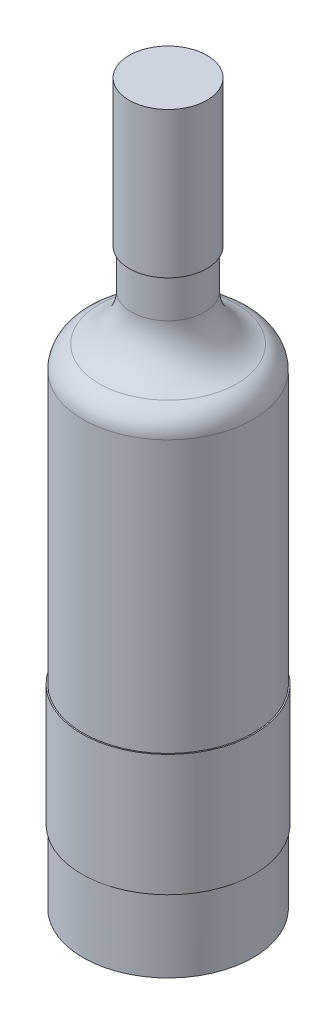
ISO-10303-21;
HEADER;
FILE_DESCRIPTION(('STEP AP214'),'2;1');
FILE_NAME('part.step','',(''),(''),'','','');
FILE_SCHEMA(('AUTOMOTIVE_DESIGN { 1 0 10303 214 1 1 1 1 }'));
ENDSEC;
DATA;
#1=APPLICATION_CONTEXT('core data for automotive mechanical design processes');
#2=APPLICATION_PROTOCOL_DEFINITION('international standard','automotive_design',2000,#1);
#3=PRODUCT_CONTEXT('',#1,'mechanical');
#4=PRODUCT('Part','Part','',(#3));
#5=PRODUCT_RELATED_PRODUCT_CATEGORY('part','',(#4));
#6=PRODUCT_DEFINITION_FORMATION('','',#4);
#7=PRODUCT_DEFINITION_CONTEXT('part definition',#1,'design');
#8=PRODUCT_DEFINITION('design','',#6,#7);
#9=PRODUCT_DEFINITION_SHAPE('','',#8);
#10=(LENGTH_UNIT() NAMED_UNIT(*) SI_UNIT(.MILLI.,.METRE.));
#11=(NAMED_UNIT(*) PLANE_ANGLE_UNIT() SI_UNIT($,.RADIAN.));
#12=(NAMED_UNIT(*) SI_UNIT($,.STERADIAN.) SOLID_ANGLE_UNIT());
#13=UNCERTAINTY_MEASURE_WITH_UNIT(LENGTH_MEASURE(1.E-05),#10,'distance_accuracy_value','');
#14=(GEOMETRIC_REPRESENTATION_CONTEXT(3) GLOBAL_UNCERTAINTY_ASSIGNED_CONTEXT((#13)) GLOBAL_UNIT_ASSIGNED_CONTEXT((#10,
#11,#12)) REPRESENTATION_CONTEXT('',''));
#15=CARTESIAN_POINT('',(0.,0.,0.));
#16=DIRECTION('',(0.,0.,1.));
#17=DIRECTION('',(1.,0.,0.));
#18=AXIS2_PLACEMENT_3D('',#15,#16,#17);
#19=CARTESIAN_POINT('',(0.,200.,0.));
#20=DIRECTION('',(0.,-1.,0.));
#21=DIRECTION('',(0.,0.,-1.));
#22=AXIS2_PLACEMENT_3D('',#19,#20,#21);
#23=CYLINDRICAL_SURFACE('',#22,35.);
#24=CARTESIAN_POINT('',(0.,191.715728752538,0.));
#25=DIRECTION('',(0.,-1.,0.));
#26=DIRECTION('',(0.,0.,-1.));
#27=AXIS2_PLACEMENT_3D('',#24,#25,#26);
#28=CIRCLE('',#27,35.);
#29=CARTESIAN_POINT('',(0.,191.715728752538,-35.));
#30=VERTEX_POINT('',#29);
#31=EDGE_CURVE('E44',#30,#30,#28,.T.);
#32=ORIENTED_EDGE('',*,*,#31,.T.);
#33=EDGE_LOOP('',(#32));
#34=FACE_BOUND('',#33,.T.);
#35=CARTESIAN_POINT('',(0.,80.,0.));
#36=DIRECTION('',(0.,-1.,0.));
#37=DIRECTION('',(0.,0.,-1.));
#38=AXIS2_PLACEMENT_3D('',#35,#36,#37);
#39=CIRCLE('',#38,35.);
#40=CARTESIAN_POINT('',(0.,80.,-35.));
#41=VERTEX_POINT('',#40);
#42=EDGE_CURVE('E10',#41,#41,#39,.T.);
#43=ORIENTED_EDGE('',*,*,#42,.F.);
#44=EDGE_LOOP('',(#43));
#45=FACE_BOUND('',#44,.T.);
#46=ADVANCED_FACE('F33',(#34,#45),#23,.T.);
#47=CARTESIAN_POINT('',(0.,295.,0.));
#48=DIRECTION('',(0.,-1.,0.));
#49=DIRECTION('',(0.,0.,-1.));
#50=AXIS2_PLACEMENT_3D('',#47,#48,#49);
#51=CYLINDRICAL_SURFACE('',#50,15.);
#52=CARTESIAN_POINT('',(0.,220.,0.));
#53=DIRECTION('',(0.,1.,0.));
#54=DIRECTION('',(0.,0.,1.));
#55=AXIS2_PLACEMENT_3D('',#52,#53,#54);
#56=CIRCLE('',#55,15.);
#57=CARTESIAN_POINT('',(0.,220.,15.));
#58=VERTEX_POINT('',#57);
#59=EDGE_CURVE('E74',#58,#58,#56,.T.);
#60=ORIENTED_EDGE('',*,*,#59,.T.);
#61=EDGE_LOOP('',(#60));
#62=FACE_BOUND('',#61,.T.);
#63=CARTESIAN_POINT('',(0.,236.,0.));
#64=DIRECTION('',(0.,1.,0.));
#65=DIRECTION('',(0.,0.,1.));
#66=AXIS2_PLACEMENT_3D('',#63,#64,#65);
#67=CIRCLE('',#66,15.);
#68=CARTESIAN_POINT('',(0.,236.,15.));
#69=VERTEX_POINT('',#68);
#70=EDGE_CURVE('E40',#69,#69,#67,.T.);
#71=ORIENTED_EDGE('',*,*,#70,.F.);
#72=EDGE_LOOP('',(#71));
#73=FACE_BOUND('',#72,.T.);
#74=ADVANCED_FACE('F92',(#62,#73),#51,.T.);
#75=CARTESIAN_POINT('',(0.,220.,0.));
#76=DIRECTION('',(0.,1.,0.));
#77=DIRECTION('',(0.,0.,1.));
#78=AXIS2_PLACEMENT_3D('',#75,#76,#77);
#79=TOROIDAL_SURFACE('',#78,35.,20.);
#80=CARTESIAN_POINT('',(0.,201.143819168359,0.));
#81=DIRECTION('',(0.,1.,0.));
#82=DIRECTION('',(0.,0.,1.));
#83=AXIS2_PLACEMENT_3D('',#80,#81,#82);
#84=CIRCLE('',#83,28.3333333333334);
#85=CARTESIAN_POINT('',(0.,201.143819168359,28.3333333333334));
#86=VERTEX_POINT('',#85);
#87=EDGE_CURVE('E49',#86,#86,#84,.T.);
#88=ORIENTED_EDGE('',*,*,#87,.T.);
#89=EDGE_LOOP('',(#88));
#90=FACE_BOUND('',#89,.T.);
#91=ORIENTED_EDGE('',*,*,#59,.F.);
#92=EDGE_LOOP('',(#91));
#93=FACE_BOUND('',#92,.T.);
#94=ADVANCED_FACE('F79',(#90,#93),#79,.F.);
#95=CARTESIAN_POINT('',(0.,191.715728752538,0.));
#96=DIRECTION('',(0.,-1.,0.));
#97=DIRECTION('',(0.,0.,-1.));
#98=AXIS2_PLACEMENT_3D('',#95,#96,#97);
#99=TOROIDAL_SURFACE('',#98,25.,10.);
#100=ORIENTED_EDGE('',*,*,#31,.F.);
#101=EDGE_LOOP('',(#100));
#102=FACE_BOUND('',#101,.T.);
#103=ORIENTED_EDGE('',*,*,#87,.F.);
#104=EDGE_LOOP('',(#103));
#105=FACE_BOUND('',#104,.T.);
#106=ADVANCED_FACE('F35',(#102,#105),#99,.T.);
#107=CARTESIAN_POINT('',(0.,236.,0.));
#108=DIRECTION('',(0.,1.,0.));
#109=DIRECTION('',(0.,0.,1.));
#110=AXIS2_PLACEMENT_3D('',#107,#108,#109);
#111=CYLINDRICAL_SURFACE('',#110,16.);
#112=CARTESIAN_POINT('',(0.,236.,0.));
#113=DIRECTION('',(0.,1.,0.));
#114=DIRECTION('',(0.,0.,1.));
#115=AXIS2_PLACEMENT_3D('',#112,#113,#114);
#116=CIRCLE('',#115,16.);
#117=CARTESIAN_POINT('',(0.,236.,16.));
#118=VERTEX_POINT('',#117);
#119=EDGE_CURVE('E59',#118,#118,#116,.T.);
#120=ORIENTED_EDGE('',*,*,#119,.T.);
#121=EDGE_LOOP('',(#120));
#122=FACE_BOUND('',#121,.T.);
#123=CARTESIAN_POINT('',(0.,296.,0.));
#124=DIRECTION('',(0.,1.,0.));
#125=DIRECTION('',(0.,0.,1.));
#126=AXIS2_PLACEMENT_3D('',#123,#124,#125);
#127=CIRCLE('',#126,16.);
#128=CARTESIAN_POINT('',(0.,296.,16.));
#129=VERTEX_POINT('',#128);
#130=EDGE_CURVE('E54',#129,#129,#127,.T.);
#131=ORIENTED_EDGE('',*,*,#130,.F.);
#132=EDGE_LOOP('',(#131));
#133=FACE_BOUND('',#132,.T.);
#134=ADVANCED_FACE('F83',(#122,#133),#111,.T.);
#135=CARTESIAN_POINT('',(0.,236.,0.));
#136=DIRECTION('',(0.,1.,0.));
#137=DIRECTION('',(0.,0.,1.));
#138=AXIS2_PLACEMENT_3D('',#135,#136,#137);
#139=PLANE('',#138);
#140=ORIENTED_EDGE('',*,*,#70,.T.);
#141=EDGE_LOOP('',(#140));
#142=FACE_BOUND('',#141,.T.);
#143=ORIENTED_EDGE('',*,*,#119,.F.);
#144=EDGE_LOOP('',(#143));
#145=FACE_BOUND('',#144,.T.);
#146=ADVANCED_FACE('F89',(#142,#145),#139,.F.);
#147=CARTESIAN_POINT('',(0.,296.,0.));
#148=DIRECTION('',(0.,1.,0.));
#149=DIRECTION('',(0.,0.,1.));
#150=AXIS2_PLACEMENT_3D('',#147,#148,#149);
#151=PLANE('',#150);
#152=ORIENTED_EDGE('',*,*,#130,.T.);
#153=EDGE_LOOP('',(#152));
#154=FACE_BOUND('',#153,.T.);
#155=ADVANCED_FACE('F121',(#154),#151,.T.);
#156=CARTESIAN_POINT('',(0.,80.,0.));
#157=DIRECTION('',(0.,-1.,0.));
#158=DIRECTION('',(0.,0.,-1.));
#159=AXIS2_PLACEMENT_3D('',#156,#157,#158);
#160=CYLINDRICAL_SURFACE('',#159,35.5);
#161=CARTESIAN_POINT('',(0.,80.,0.));
#162=DIRECTION('',(0.,-1.,0.));
#163=DIRECTION('',(0.,0.,-1.));
#164=AXIS2_PLACEMENT_3D('',#161,#162,#163);
#165=CIRCLE('',#164,35.5);
#166=CARTESIAN_POINT('',(0.,80.,-35.5));
#167=VERTEX_POINT('',#166);
#168=EDGE_CURVE('E55',#167,#167,#165,.T.);
#169=ORIENTED_EDGE('',*,*,#168,.T.);
#170=EDGE_LOOP('',(#169));
#171=FACE_BOUND('',#170,.T.);
#172=CARTESIAN_POINT('',(0.,30.,0.));
#173=DIRECTION('',(0.,-1.,0.));
#174=DIRECTION('',(0.,0.,-1.));
#175=AXIS2_PLACEMENT_3D('',#172,#173,#174);
#176=CIRCLE('',#175,35.5);
#177=CARTESIAN_POINT('',(0.,30.,-35.5));
#178=VERTEX_POINT('',#177);
#179=EDGE_CURVE('E62',#178,#178,#176,.T.);
#180=ORIENTED_EDGE('',*,*,#179,.F.);
#181=EDGE_LOOP('',(#180));
#182=FACE_BOUND('',#181,.T.);
#183=ADVANCED_FACE('F124',(#171,#182),#160,.T.);
#184=CARTESIAN_POINT('',(0.,80.,0.));
#185=DIRECTION('',(0.,-1.,0.));
#186=DIRECTION('',(0.,0.,-1.));
#187=AXIS2_PLACEMENT_3D('',#184,#185,#186);
#188=PLANE('',#187);
#189=ORIENTED_EDGE('',*,*,#42,.T.);
#190=EDGE_LOOP('',(#189));
#191=FACE_BOUND('',#190,.T.);
#192=ORIENTED_EDGE('',*,*,#168,.F.);
#193=EDGE_LOOP('',(#192));
#194=FACE_BOUND('',#193,.T.);
#195=ADVANCED_FACE('F117',(#191,#194),#188,.F.);
#196=CARTESIAN_POINT('',(0.,30.,0.));
#197=DIRECTION('',(0.,-1.,0.));
#198=DIRECTION('',(0.,0.,-1.));
#199=AXIS2_PLACEMENT_3D('',#196,#197,#198);
#200=PLANE('',#199);
#201=CARTESIAN_POINT('',(0.,30.,0.));
#202=DIRECTION('',(0.,-1.,0.));
#203=DIRECTION('',(0.,0.,-1.));
#204=AXIS2_PLACEMENT_3D('',#201,#202,#203);
#205=CIRCLE('',#204,35.);
#206=CARTESIAN_POINT('',(0.,30.,-35.));
#207=VERTEX_POINT('',#206);
#208=EDGE_CURVE('E52',#207,#207,#205,.T.);
#209=ORIENTED_EDGE('',*,*,#208,.F.);
#210=EDGE_LOOP('',(#209));
#211=FACE_BOUND('',#210,.T.);
#212=ORIENTED_EDGE('',*,*,#179,.T.);
#213=EDGE_LOOP('',(#212));
#214=FACE_BOUND('',#213,.T.);
#215=ADVANCED_FACE('F110',(#211,#214),#200,.T.);
#216=CARTESIAN_POINT('',(0.,0.,0.));
#217=DIRECTION('',(0.,1.,0.));
#218=DIRECTION('',(0.,0.,1.));
#219=AXIS2_PLACEMENT_3D('',#216,#217,#218);
#220=PLANE('',#219);
#221=CARTESIAN_POINT('',(0.,0.,0.));
#222=DIRECTION('',(0.,1.,0.));
#223=DIRECTION('',(0.,0.,1.));
#224=AXIS2_PLACEMENT_3D('',#221,#222,#223);
#225=CIRCLE('',#224,35.);
#226=CARTESIAN_POINT('',(0.,0.,35.));
#227=VERTEX_POINT('',#226);
#228=EDGE_CURVE('E70',#227,#227,#225,.T.);
#229=ORIENTED_EDGE('',*,*,#228,.F.);
#230=EDGE_LOOP('',(#229));
#231=FACE_BOUND('',#230,.T.);
#232=ADVANCED_FACE('F106',(#231),#220,.F.);
#233=ORIENTED_EDGE('',*,*,#208,.T.);
#234=EDGE_LOOP('',(#233));
#235=FACE_BOUND('',#234,.T.);
#236=ORIENTED_EDGE('',*,*,#228,.T.);
#237=EDGE_LOOP('',(#236));
#238=FACE_BOUND('',#237,.T.);
#239=ADVANCED_FACE('F97',(#235,#238),#23,.T.);
#240=CLOSED_SHELL('',(#46,#74,#94,#106,#134,#146,#155,#183,#195,#215,#232,#239));
#241=MANIFOLD_SOLID_BREP('B2',#240);
#242=ADVANCED_BREP_SHAPE_REPRESENTATION('',(#18,#241),#14);
#243=SHAPE_DEFINITION_REPRESENTATION(#9,#242);
ENDSEC;
END-ISO-10303-21;
